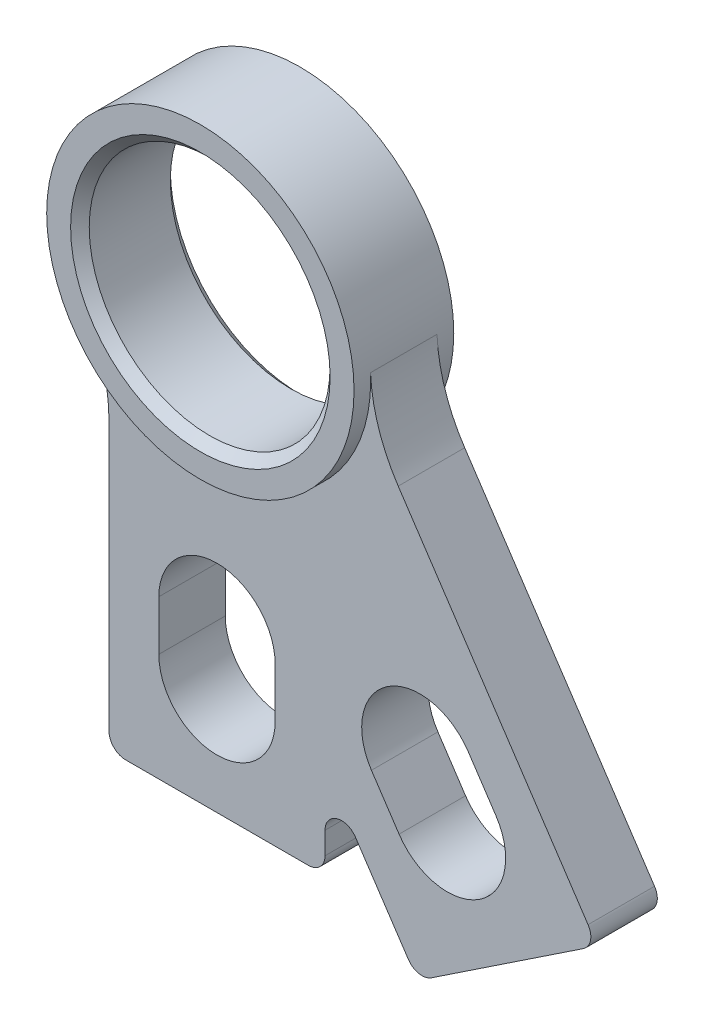
ISO-10303-21;
HEADER;
FILE_DESCRIPTION(('STEP AP214'),'2;1');
FILE_NAME('part.step','',(''),(''),'','','');
FILE_SCHEMA(('AUTOMOTIVE_DESIGN { 1 0 10303 214 1 1 1 1 }'));
ENDSEC;
DATA;
#1=APPLICATION_CONTEXT('core data for automotive mechanical design processes');
#2=APPLICATION_PROTOCOL_DEFINITION('international standard','automotive_design',2000,#1);
#3=PRODUCT_CONTEXT('',#1,'mechanical');
#4=PRODUCT('Part','Part','',(#3));
#5=PRODUCT_RELATED_PRODUCT_CATEGORY('part','',(#4));
#6=PRODUCT_DEFINITION_FORMATION('','',#4);
#7=PRODUCT_DEFINITION_CONTEXT('part definition',#1,'design');
#8=PRODUCT_DEFINITION('design','',#6,#7);
#9=PRODUCT_DEFINITION_SHAPE('','',#8);
#10=(LENGTH_UNIT() NAMED_UNIT(*) SI_UNIT(.MILLI.,.METRE.));
#11=(NAMED_UNIT(*) PLANE_ANGLE_UNIT() SI_UNIT($,.RADIAN.));
#12=(NAMED_UNIT(*) SI_UNIT($,.STERADIAN.) SOLID_ANGLE_UNIT());
#13=UNCERTAINTY_MEASURE_WITH_UNIT(LENGTH_MEASURE(1.E-05),#10,'distance_accuracy_value','');
#14=(GEOMETRIC_REPRESENTATION_CONTEXT(3) GLOBAL_UNCERTAINTY_ASSIGNED_CONTEXT((#13)) GLOBAL_UNIT_ASSIGNED_CONTEXT((#10,
#11,#12)) REPRESENTATION_CONTEXT('',''));
#15=CARTESIAN_POINT('',(0.,0.,0.));
#16=DIRECTION('',(0.,0.,1.));
#17=DIRECTION('',(1.,0.,0.));
#18=AXIS2_PLACEMENT_3D('',#15,#16,#17);
#19=CARTESIAN_POINT('',(0.,0.,4.7625));
#20=DIRECTION('',(0.,0.,-1.));
#21=DIRECTION('',(-1.,0.,0.));
#22=AXIS2_PLACEMENT_3D('',#19,#20,#21);
#23=CYLINDRICAL_SURFACE('',#22,11.5062);
#24=CARTESIAN_POINT('',(0.,0.,-3.87350000000002));
#25=DIRECTION('',(0.,0.,1.));
#26=DIRECTION('',(1.,0.,0.));
#27=AXIS2_PLACEMENT_3D('',#24,#25,#26);
#28=CIRCLE('',#27,11.5062);
#29=CARTESIAN_POINT('',(-11.5062,0.,-3.87350000000002));
#30=VERTEX_POINT('',#29);
#31=EDGE_CURVE('E50',#30,#30,#28,.F.);
#32=CARTESIAN_POINT('',(0.,0.,3.87349999999995));
#33=DIRECTION('',(0.,0.,1.));
#34=DIRECTION('',(1.,0.,0.));
#35=AXIS2_PLACEMENT_3D('',#32,#33,#34);
#36=CIRCLE('',#35,11.5062);
#37=CARTESIAN_POINT('',(-11.5062,0.,3.87349999999995));
#38=VERTEX_POINT('',#37);
#39=EDGE_CURVE('E490',#38,#38,#36,.T.);
#40=CARTESIAN_POINT('',(-11.5062,0.,-3.87350000000002));
#41=CARTESIAN_POINT('',(-11.5062,0.,-3.79280208333335));
#42=CARTESIAN_POINT('',(-11.5062,0.,-3.71210416666669));
#43=CARTESIAN_POINT('',(-11.5062,0.,-3.55070833333335));
#44=CARTESIAN_POINT('',(-11.5062,0.,-3.47001041666669));
#45=CARTESIAN_POINT('',(-11.5062,0.,-3.30861458333336));
#46=CARTESIAN_POINT('',(-11.5062,0.,-3.22791666666669));
#47=CARTESIAN_POINT('',(-11.5062,0.,-3.06652083333336));
#48=CARTESIAN_POINT('',(-11.5062,0.,-2.98582291666669));
#49=CARTESIAN_POINT('',(-11.5062,0.,-2.82442708333336));
#50=CARTESIAN_POINT('',(-11.5062,0.,-2.74372916666669));
#51=CARTESIAN_POINT('',(-11.5062,0.,-2.58233333333336));
#52=CARTESIAN_POINT('',(-11.5062,0.,-2.50163541666669));
#53=CARTESIAN_POINT('',(-11.5062,0.,-2.34023958333336));
#54=CARTESIAN_POINT('',(-11.5062,0.,-2.25954166666669));
#55=CARTESIAN_POINT('',(-11.5062,0.,-2.09814583333336));
#56=CARTESIAN_POINT('',(-11.5062,0.,-2.01744791666669));
#57=CARTESIAN_POINT('',(-11.5062,0.,-1.85605208333336));
#58=CARTESIAN_POINT('',(-11.5062,0.,-1.7753541666667));
#59=CARTESIAN_POINT('',(-11.5062,0.,-1.61395833333336));
#60=CARTESIAN_POINT('',(-11.5062,0.,-1.5332604166667));
#61=CARTESIAN_POINT('',(-11.5062,0.,-1.37186458333336));
#62=CARTESIAN_POINT('',(-11.5062,0.,-1.2911666666667));
#63=CARTESIAN_POINT('',(-11.5062,0.,-1.12977083333336));
#64=CARTESIAN_POINT('',(-11.5062,0.,-1.0490729166667));
#65=CARTESIAN_POINT('',(-11.5062,0.,-0.887677083333366));
#66=CARTESIAN_POINT('',(-11.5062,0.,-0.8069791666667));
#67=CARTESIAN_POINT('',(-11.5062,0.,-0.645583333333367));
#68=CARTESIAN_POINT('',(-11.5062,0.,-0.5648854166667));
#69=CARTESIAN_POINT('',(-11.5062,0.,-0.403489583333367));
#70=CARTESIAN_POINT('',(-11.5062,0.,-0.322791666666701));
#71=CARTESIAN_POINT('',(-11.5062,0.,-0.161395833333368));
#72=CARTESIAN_POINT('',(-11.5062,0.,-0.080697916666702));
#73=CARTESIAN_POINT('',(-11.5062,0.,0.0806979166666309));
#74=CARTESIAN_POINT('',(-11.5062,0.,0.161395833333297));
#75=CARTESIAN_POINT('',(-11.5062,0.,0.32279166666663));
#76=CARTESIAN_POINT('',(-11.5062,0.,0.403489583333297));
#77=CARTESIAN_POINT('',(-11.5062,0.,0.564885416666629));
#78=CARTESIAN_POINT('',(-11.5062,0.,0.645583333333295));
#79=CARTESIAN_POINT('',(-11.5062,0.,0.806979166666628));
#80=CARTESIAN_POINT('',(-11.5062,0.,0.887677083333294));
#81=CARTESIAN_POINT('',(-11.5062,0.,1.04907291666663));
#82=CARTESIAN_POINT('',(-11.5062,0.,1.12977083333329));
#83=CARTESIAN_POINT('',(-11.5062,0.,1.29116666666663));
#84=CARTESIAN_POINT('',(-11.5062,0.,1.37186458333329));
#85=CARTESIAN_POINT('',(-11.5062,0.,1.53326041666663));
#86=CARTESIAN_POINT('',(-11.5062,0.,1.61395833333329));
#87=CARTESIAN_POINT('',(-11.5062,0.,1.77535416666662));
#88=CARTESIAN_POINT('',(-11.5062,0.,1.85605208333329));
#89=CARTESIAN_POINT('',(-11.5062,0.,2.01744791666662));
#90=CARTESIAN_POINT('',(-11.5062,0.,2.09814583333329));
#91=CARTESIAN_POINT('',(-11.5062,0.,2.25954166666662));
#92=CARTESIAN_POINT('',(-11.5062,0.,2.34023958333329));
#93=CARTESIAN_POINT('',(-11.5062,0.,2.50163541666662));
#94=CARTESIAN_POINT('',(-11.5062,0.,2.58233333333329));
#95=CARTESIAN_POINT('',(-11.5062,0.,2.74372916666662));
#96=CARTESIAN_POINT('',(-11.5062,0.,2.82442708333329));
#97=CARTESIAN_POINT('',(-11.5062,0.,2.98582291666662));
#98=CARTESIAN_POINT('',(-11.5062,0.,3.06652083333329));
#99=CARTESIAN_POINT('',(-11.5062,0.,3.22791666666662));
#100=CARTESIAN_POINT('',(-11.5062,0.,3.30861458333328));
#101=CARTESIAN_POINT('',(-11.5062,0.,3.47001041666662));
#102=CARTESIAN_POINT('',(-11.5062,0.,3.55070833333328));
#103=CARTESIAN_POINT('',(-11.5062,0.,3.71210416666662));
#104=CARTESIAN_POINT('',(-11.5062,0.,3.79280208333328));
#105=CARTESIAN_POINT('',(-11.5062,0.,3.87349999999995));
#106=B_SPLINE_CURVE_WITH_KNOTS('',3,(#40,#41,#42,#43,#44,#45,#46,#47,#48,#49,#50,#51,#52,#53,
#54,#55,#56,#57,#58,#59,#60,#61,#62,#63,#64,#65,#66,#67,#68,#69,#70,#71,#72,#73,#74,#75,#76,#77,
#78,#79,#80,#81,#82,#83,#84,#85,#86,#87,#88,#89,#90,#91,#92,#93,#94,#95,#96,#97,#98,#99,#100,
#101,#102,#103,#104,#105),.UNSPECIFIED.,.F.,.F.,(4,2,2,2,2,2,2,2,2,2,2,2,2,2,2,2,2,2,2,2,2,2,2,
2,2,2,2,2,2,2,2,2,4),(0.,0.242093749999998,0.484187499999998,0.726281249999997,
0.968374999999995,1.21046874999999,1.45256249999999,1.69465624999999,1.93674999999999,
2.17884374999999,2.42093749999999,2.66303124999999,2.90512499999999,3.14721874999999,
3.38931249999999,3.63140624999999,3.87349999999998,4.11559374999998,4.35768749999998,
4.59978124999998,4.84187499999998,5.08396874999998,5.32606249999998,5.56815624999998,
5.81024999999998,6.05234374999998,6.29443749999997,6.53653124999997,6.77862499999997,
7.02071874999997,7.26281249999997,7.50490624999997,7.74699999999997),.UNSPECIFIED.);
#107=EDGE_CURVE('BSEAM41',#30,#38,#106,.T.);
#108=ORIENTED_EDGE('',*,*,#31,.T.);
#109=ORIENTED_EDGE('',*,*,#39,.T.);
#110=ORIENTED_EDGE('',*,*,#107,.T.);
#111=ORIENTED_EDGE('',*,*,#107,.F.);
#112=EDGE_LOOP('',(#108,#110,#109,#111));
#113=FACE_BOUND('',#112,.T.);
#114=ADVANCED_FACE('F41',(#113),#23,.F.);
#115=CARTESIAN_POINT('',(0.,0.,4.7625));
#116=DIRECTION('',(0.,0.,-1.));
#117=DIRECTION('',(-1.,0.,0.));
#118=AXIS2_PLACEMENT_3D('',#115,#116,#117);
#119=CYLINDRICAL_SURFACE('',#118,14.6812);
#120=DIRECTION('',(0.,0.,-1.));
#121=VECTOR('',#120,1.);
#122=CARTESIAN_POINT('',(-12.585193266832,-7.55979787272684,3.175));
#123=LINE('',#122,#121);
#124=CARTESIAN_POINT('',(-12.585193266832,-7.55979787272684,3.175));
#125=VERTEX_POINT('',#124);
#126=CARTESIAN_POINT('',(-12.585193266832,-7.55979787272684,-3.175));
#127=VERTEX_POINT('',#126);
#128=EDGE_CURVE('E249',#125,#127,#123,.T.);
#129=ORIENTED_EDGE('',*,*,#128,.F.);
#130=CARTESIAN_POINT('',(0.,0.,3.175));
#131=DIRECTION('',(0.,0.,1.));
#132=DIRECTION('',(1.,0.,0.));
#133=AXIS2_PLACEMENT_3D('',#130,#131,#132);
#134=CIRCLE('',#133,14.6812);
#135=CARTESIAN_POINT('',(14.6650649234858,0.688116436328533,3.175));
#136=VERTEX_POINT('',#135);
#137=EDGE_CURVE('E266',#125,#136,#134,.T.);
#138=ORIENTED_EDGE('',*,*,#137,.T.);
#139=DIRECTION('',(0.,0.,-1.));
#140=VECTOR('',#139,1.);
#141=CARTESIAN_POINT('',(14.6650649234858,0.688116436328532,3.175));
#142=LINE('',#141,#140);
#143=CARTESIAN_POINT('',(14.6650649234858,0.688116436328532,-3.175));
#144=VERTEX_POINT('',#143);
#145=EDGE_CURVE('E323',#136,#144,#142,.T.);
#146=ORIENTED_EDGE('',*,*,#145,.T.);
#147=CARTESIAN_POINT('',(0.,0.,-3.175));
#148=DIRECTION('',(0.,0.,1.));
#149=DIRECTION('',(1.,0.,0.));
#150=AXIS2_PLACEMENT_3D('',#147,#148,#149);
#151=CIRCLE('',#150,14.6812);
#152=EDGE_CURVE('E324',#127,#144,#151,.T.);
#153=ORIENTED_EDGE('',*,*,#152,.F.);
#154=EDGE_LOOP('',(#129,#138,#146,#153));
#155=FACE_BOUND('',#154,.T.);
#156=CARTESIAN_POINT('',(0.,0.,4.7625));
#157=DIRECTION('',(0.,0.,1.));
#158=DIRECTION('',(1.,0.,0.));
#159=AXIS2_PLACEMENT_3D('',#156,#157,#158);
#160=CIRCLE('',#159,14.6812);
#161=CARTESIAN_POINT('',(14.6812,0.,4.7625));
#162=VERTEX_POINT('',#161);
#163=EDGE_CURVE('E418',#162,#162,#160,.T.);
#164=ORIENTED_EDGE('',*,*,#163,.F.);
#165=EDGE_LOOP('',(#164));
#166=FACE_BOUND('',#165,.T.);
#167=CARTESIAN_POINT('',(0.,0.,-4.7625));
#168=DIRECTION('',(0.,0.,1.));
#169=DIRECTION('',(1.,0.,0.));
#170=AXIS2_PLACEMENT_3D('',#167,#168,#169);
#171=CIRCLE('',#170,14.6812);
#172=CARTESIAN_POINT('',(14.6812,0.,-4.7625));
#173=VERTEX_POINT('',#172);
#174=EDGE_CURVE('E399',#173,#173,#171,.T.);
#175=ORIENTED_EDGE('',*,*,#174,.T.);
#176=EDGE_LOOP('',(#175));
#177=FACE_BOUND('',#176,.T.);
#178=ADVANCED_FACE('F513',(#155,#166,#177),#119,.T.);
#179=CARTESIAN_POINT('',(0.,0.,4.7625));
#180=DIRECTION('',(0.,0.,1.));
#181=DIRECTION('',(1.,0.,0.));
#182=AXIS2_PLACEMENT_3D('',#179,#180,#181);
#183=PLANE('',#182);
#184=CARTESIAN_POINT('',(0.,0.,4.7625));
#185=DIRECTION('',(0.,0.,1.));
#186=DIRECTION('',(1.,0.,0.));
#187=AXIS2_PLACEMENT_3D('',#184,#185,#186);
#188=CIRCLE('',#187,12.3952000000001);
#189=CARTESIAN_POINT('',(12.3952000000001,0.,4.7625));
#190=VERTEX_POINT('',#189);
#191=EDGE_CURVE('E11',#190,#190,#188,.F.);
#192=ORIENTED_EDGE('',*,*,#191,.T.);
#193=EDGE_LOOP('',(#192));
#194=FACE_BOUND('',#193,.T.);
#195=ORIENTED_EDGE('',*,*,#163,.T.);
#196=EDGE_LOOP('',(#195));
#197=FACE_BOUND('',#196,.T.);
#198=ADVANCED_FACE('F509',(#194,#197),#183,.T.);
#199=CARTESIAN_POINT('',(0.,0.,-4.7625));
#200=DIRECTION('',(0.,0.,1.));
#201=DIRECTION('',(1.,0.,0.));
#202=AXIS2_PLACEMENT_3D('',#199,#200,#201);
#203=PLANE('',#202);
#204=CARTESIAN_POINT('',(0.,0.,-4.7625));
#205=DIRECTION('',(0.,0.,1.));
#206=DIRECTION('',(1.,0.,0.));
#207=AXIS2_PLACEMENT_3D('',#204,#205,#206);
#208=CIRCLE('',#207,12.3952);
#209=CARTESIAN_POINT('',(-12.3952,0.,-4.7625));
#210=VERTEX_POINT('',#209);
#211=EDGE_CURVE('E486',#210,#210,#208,.T.);
#212=ORIENTED_EDGE('',*,*,#211,.T.);
#213=EDGE_LOOP('',(#212));
#214=FACE_BOUND('',#213,.T.);
#215=ORIENTED_EDGE('',*,*,#174,.F.);
#216=EDGE_LOOP('',(#215));
#217=FACE_BOUND('',#216,.T.);
#218=ADVANCED_FACE('F505',(#214,#217),#203,.F.);
#219=CARTESIAN_POINT('',(0.,-27.9580697939255,3.175));
#220=DIRECTION('',(0.,0.,-1.));
#221=DIRECTION('',(-1.,0.,0.));
#222=AXIS2_PLACEMENT_3D('',#219,#220,#221);
#223=CYLINDRICAL_SURFACE('',#222,5.55624999999843);
#224=CARTESIAN_POINT('',(0.,-27.9580697939255,-3.175));
#225=DIRECTION('',(0.,0.,1.));
#226=DIRECTION('',(1.,0.,0.));
#227=AXIS2_PLACEMENT_3D('',#224,#225,#226);
#228=CIRCLE('',#227,5.55624999999843);
#229=CARTESIAN_POINT('',(5.55624999999843,-27.9580697939256,-3.175));
#230=VERTEX_POINT('',#229);
#231=CARTESIAN_POINT('',(-5.55624999999843,-27.9580697939256,-3.175));
#232=VERTEX_POINT('',#231);
#233=EDGE_CURVE('E371',#230,#232,#228,.T.);
#234=ORIENTED_EDGE('',*,*,#233,.F.);
#235=DIRECTION('',(0.,0.,-1.));
#236=VECTOR('',#235,1.);
#237=CARTESIAN_POINT('',(5.55624999999843,-27.9580697939256,3.175));
#238=LINE('',#237,#236);
#239=CARTESIAN_POINT('',(5.55624999999843,-27.9580697939256,3.175));
#240=VERTEX_POINT('',#239);
#241=EDGE_CURVE('E396',#240,#230,#238,.T.);
#242=ORIENTED_EDGE('',*,*,#241,.F.);
#243=CARTESIAN_POINT('',(0.,-27.9580697939255,3.175));
#244=DIRECTION('',(0.,0.,1.));
#245=DIRECTION('',(1.,0.,0.));
#246=AXIS2_PLACEMENT_3D('',#243,#244,#245);
#247=CIRCLE('',#246,5.55624999999843);
#248=CARTESIAN_POINT('',(-5.55624999999843,-27.9580697939256,3.175));
#249=VERTEX_POINT('',#248);
#250=EDGE_CURVE('E308',#240,#249,#247,.T.);
#251=ORIENTED_EDGE('',*,*,#250,.T.);
#252=DIRECTION('',(0.,0.,-1.));
#253=VECTOR('',#252,1.);
#254=CARTESIAN_POINT('',(-5.55624999999843,-27.9580697939256,3.175));
#255=LINE('',#254,#253);
#256=EDGE_CURVE('E386',#249,#232,#255,.T.);
#257=ORIENTED_EDGE('',*,*,#256,.T.);
#258=EDGE_LOOP('',(#234,#242,#251,#257));
#259=FACE_BOUND('',#258,.T.);
#260=ADVANCED_FACE('F508',(#259),#223,.F.);
#261=CARTESIAN_POINT('',(5.55624999999843,0.,3.175));
#262=DIRECTION('',(-1.,0.,0.));
#263=DIRECTION('',(0.,0.,1.));
#264=AXIS2_PLACEMENT_3D('',#261,#262,#263);
#265=PLANE('',#264);
#266=DIRECTION('',(0.,1.,0.));
#267=VECTOR('',#266,1.);
#268=CARTESIAN_POINT('',(5.55624999999843,0.,-3.175));
#269=LINE('',#268,#267);
#270=CARTESIAN_POINT('',(5.55624999999843,-32.7205697939288,-3.175));
#271=VERTEX_POINT('',#270);
#272=EDGE_CURVE('E375',#271,#230,#269,.T.);
#273=ORIENTED_EDGE('',*,*,#272,.F.);
#274=DIRECTION('',(0.,0.,-1.));
#275=VECTOR('',#274,1.);
#276=CARTESIAN_POINT('',(5.55624999999843,-32.7205697939288,3.175));
#277=LINE('',#276,#275);
#278=CARTESIAN_POINT('',(5.55624999999843,-32.7205697939288,3.175));
#279=VERTEX_POINT('',#278);
#280=EDGE_CURVE('E393',#279,#271,#277,.T.);
#281=ORIENTED_EDGE('',*,*,#280,.F.);
#282=DIRECTION('',(0.,1.,0.));
#283=VECTOR('',#282,1.);
#284=CARTESIAN_POINT('',(5.55624999999843,0.,3.175));
#285=LINE('',#284,#283);
#286=EDGE_CURVE('E312',#279,#240,#285,.T.);
#287=ORIENTED_EDGE('',*,*,#286,.T.);
#288=ORIENTED_EDGE('',*,*,#241,.T.);
#289=EDGE_LOOP('',(#273,#281,#287,#288));
#290=FACE_BOUND('',#289,.T.);
#291=ADVANCED_FACE('F652',(#290),#265,.T.);
#292=CARTESIAN_POINT('',(0.,-32.7205697939288,3.175));
#293=DIRECTION('',(0.,0.,-1.));
#294=DIRECTION('',(-1.,0.,0.));
#295=AXIS2_PLACEMENT_3D('',#292,#293,#294);
#296=CYLINDRICAL_SURFACE('',#295,5.55624999999843);
#297=CARTESIAN_POINT('',(0.,-32.7205697939288,-3.175));
#298=DIRECTION('',(0.,0.,1.));
#299=DIRECTION('',(1.,0.,0.));
#300=AXIS2_PLACEMENT_3D('',#297,#298,#299);
#301=CIRCLE('',#300,5.55624999999843);
#302=CARTESIAN_POINT('',(-5.55624999999843,-32.7205697939288,-3.175));
#303=VERTEX_POINT('',#302);
#304=EDGE_CURVE('E379',#303,#271,#301,.T.);
#305=ORIENTED_EDGE('',*,*,#304,.F.);
#306=DIRECTION('',(0.,0.,-1.));
#307=VECTOR('',#306,1.);
#308=CARTESIAN_POINT('',(-5.55624999999843,-32.7205697939288,3.175));
#309=LINE('',#308,#307);
#310=CARTESIAN_POINT('',(-5.55624999999843,-32.7205697939288,3.175));
#311=VERTEX_POINT('',#310);
#312=EDGE_CURVE('E389',#311,#303,#309,.T.);
#313=ORIENTED_EDGE('',*,*,#312,.F.);
#314=CARTESIAN_POINT('',(0.,-32.7205697939288,3.175));
#315=DIRECTION('',(0.,0.,1.));
#316=DIRECTION('',(1.,0.,0.));
#317=AXIS2_PLACEMENT_3D('',#314,#315,#316);
#318=CIRCLE('',#317,5.55624999999843);
#319=EDGE_CURVE('E316',#311,#279,#318,.T.);
#320=ORIENTED_EDGE('',*,*,#319,.T.);
#321=ORIENTED_EDGE('',*,*,#280,.T.);
#322=EDGE_LOOP('',(#305,#313,#320,#321));
#323=FACE_BOUND('',#322,.T.);
#324=ADVANCED_FACE('F619',(#323),#296,.F.);
#325=CARTESIAN_POINT('',(19.3774540600737,-29.0780398371844,3.175));
#326=DIRECTION('',(0.,0.,-1.));
#327=DIRECTION('',(-1.,0.,0.));
#328=AXIS2_PLACEMENT_3D('',#325,#326,#327);
#329=CYLINDRICAL_SURFACE('',#328,5.55624999999838);
#330=CARTESIAN_POINT('',(19.3774540600737,-29.0780398371844,-3.175));
#331=DIRECTION('',(0.,0.,1.));
#332=DIRECTION('',(1.,0.,0.));
#333=AXIS2_PLACEMENT_3D('',#330,#331,#332);
#334=CIRCLE('',#333,5.55624999999838);
#335=CARTESIAN_POINT('',(24.0011136239908,-25.9968572234013,-3.175));
#336=VERTEX_POINT('',#335);
#337=CARTESIAN_POINT('',(14.7537944961565,-32.1592224509675,-3.175));
#338=VERTEX_POINT('',#337);
#339=EDGE_CURVE('E355',#336,#338,#334,.T.);
#340=ORIENTED_EDGE('',*,*,#339,.F.);
#341=DIRECTION('',(0.,0.,-1.));
#342=VECTOR('',#341,1.);
#343=CARTESIAN_POINT('',(24.0011136239908,-25.9968572234013,3.175));
#344=LINE('',#343,#342);
#345=CARTESIAN_POINT('',(24.0011136239908,-25.9968572234013,3.175));
#346=VERTEX_POINT('',#345);
#347=EDGE_CURVE('E390',#346,#336,#344,.T.);
#348=ORIENTED_EDGE('',*,*,#347,.F.);
#349=CARTESIAN_POINT('',(19.3774540600737,-29.0780398371844,3.175));
#350=DIRECTION('',(0.,0.,1.));
#351=DIRECTION('',(1.,0.,0.));
#352=AXIS2_PLACEMENT_3D('',#349,#350,#351);
#353=CIRCLE('',#352,5.55624999999838);
#354=CARTESIAN_POINT('',(14.7537944961565,-32.1592224509675,3.175));
#355=VERTEX_POINT('',#354);
#356=EDGE_CURVE('E293',#346,#355,#353,.T.);
#357=ORIENTED_EDGE('',*,*,#356,.T.);
#358=DIRECTION('',(0.,0.,-1.));
#359=VECTOR('',#358,1.);
#360=CARTESIAN_POINT('',(14.7537944961565,-32.1592224509675,3.175));
#361=LINE('',#360,#359);
#362=EDGE_CURVE('E400',#355,#338,#361,.T.);
#363=ORIENTED_EDGE('',*,*,#362,.T.);
#364=EDGE_LOOP('',(#340,#348,#357,#363));
#365=FACE_BOUND('',#364,.T.);
#366=ADVANCED_FACE('F611',(#365),#329,.F.);
#367=CARTESIAN_POINT('',(4.62365956391723,3.08118261378313,3.175));
#368=DIRECTION('',(-0.832154702167563,-0.554543552537052,0.));
#369=DIRECTION('',(0.554543552537052,-0.832154702167563,0.));
#370=AXIS2_PLACEMENT_3D('',#367,#368,#369);
#371=PLANE('',#370);
#372=DIRECTION('',(-0.554543552537052,0.832154702167563,0.));
#373=VECTOR('',#372,1.);
#374=CARTESIAN_POINT('',(4.62365956391723,3.08118261378313,-3.175));
#375=LINE('',#374,#373);
#376=CARTESIAN_POINT('',(26.6421272929503,-29.959993992477,-3.175));
#377=VERTEX_POINT('',#376);
#378=EDGE_CURVE('E359',#377,#336,#375,.T.);
#379=ORIENTED_EDGE('',*,*,#378,.F.);
#380=DIRECTION('',(0.,0.,-1.));
#381=VECTOR('',#380,1.);
#382=CARTESIAN_POINT('',(26.6421272929503,-29.959993992477,3.175));
#383=LINE('',#382,#381);
#384=CARTESIAN_POINT('',(26.6421272929503,-29.959993992477,3.175));
#385=VERTEX_POINT('',#384);
#386=EDGE_CURVE('E406',#385,#377,#383,.T.);
#387=ORIENTED_EDGE('',*,*,#386,.F.);
#388=DIRECTION('',(-0.554543552537052,0.832154702167563,0.));
#389=VECTOR('',#388,1.);
#390=CARTESIAN_POINT('',(4.62365956391723,3.08118261378313,3.175));
#391=LINE('',#390,#389);
#392=EDGE_CURVE('E297',#385,#346,#391,.T.);
#393=ORIENTED_EDGE('',*,*,#392,.T.);
#394=ORIENTED_EDGE('',*,*,#347,.T.);
#395=EDGE_LOOP('',(#379,#387,#393,#394));
#396=FACE_BOUND('',#395,.T.);
#397=ADVANCED_FACE('F605',(#396),#371,.T.);
#398=CARTESIAN_POINT('',(22.0184677290332,-33.0411766062601,3.175));
#399=DIRECTION('',(0.,0.,-1.));
#400=DIRECTION('',(-1.,0.,0.));
#401=AXIS2_PLACEMENT_3D('',#398,#399,#400);
#402=CYLINDRICAL_SURFACE('',#401,5.55624999999838);
#403=CARTESIAN_POINT('',(22.0184677290332,-33.0411766062601,-3.175));
#404=DIRECTION('',(0.,0.,1.));
#405=DIRECTION('',(1.,0.,0.));
#406=AXIS2_PLACEMENT_3D('',#403,#404,#405);
#407=CIRCLE('',#406,5.55624999999838);
#408=CARTESIAN_POINT('',(17.394808165116,-36.1223592200432,-3.175));
#409=VERTEX_POINT('',#408);
#410=EDGE_CURVE('E363',#409,#377,#407,.T.);
#411=ORIENTED_EDGE('',*,*,#410,.F.);
#412=DIRECTION('',(0.,0.,-1.));
#413=VECTOR('',#412,1.);
#414=CARTESIAN_POINT('',(17.394808165116,-36.1223592200432,3.175));
#415=LINE('',#414,#413);
#416=CARTESIAN_POINT('',(17.394808165116,-36.1223592200432,3.175));
#417=VERTEX_POINT('',#416);
#418=EDGE_CURVE('E403',#417,#409,#415,.T.);
#419=ORIENTED_EDGE('',*,*,#418,.F.);
#420=CARTESIAN_POINT('',(22.0184677290332,-33.0411766062601,3.175));
#421=DIRECTION('',(0.,0.,1.));
#422=DIRECTION('',(1.,0.,0.));
#423=AXIS2_PLACEMENT_3D('',#420,#421,#422);
#424=CIRCLE('',#423,5.55624999999838);
#425=EDGE_CURVE('E301',#417,#385,#424,.T.);
#426=ORIENTED_EDGE('',*,*,#425,.T.);
#427=ORIENTED_EDGE('',*,*,#386,.T.);
#428=EDGE_LOOP('',(#411,#419,#426,#427));
#429=FACE_BOUND('',#428,.T.);
#430=ADVANCED_FACE('F601',(#429),#402,.F.);
#431=CARTESIAN_POINT('',(-26.1937499999968,-15.7343197939272,3.175));
#432=DIRECTION('',(0.,0.,-1.));
#433=DIRECTION('',(-1.,0.,0.));
#434=AXIS2_PLACEMENT_3D('',#431,#432,#433);
#435=CYLINDRICAL_SURFACE('',#434,15.8749999999984);
#436=CARTESIAN_POINT('',(-26.1937499999968,-15.7343197939272,-3.175));
#437=DIRECTION('',(0.,0.,1.));
#438=DIRECTION('',(1.,0.,0.));
#439=AXIS2_PLACEMENT_3D('',#436,#437,#438);
#440=CIRCLE('',#439,15.8749999999984);
#441=CARTESIAN_POINT('',(-10.3187499999984,-15.7343197939272,-3.175));
#442=VERTEX_POINT('',#441);
#443=EDGE_CURVE('E244',#442,#127,#440,.T.);
#444=ORIENTED_EDGE('',*,*,#443,.F.);
#445=DIRECTION('',(0.,0.,-1.));
#446=VECTOR('',#445,1.);
#447=CARTESIAN_POINT('',(-10.3187499999984,-15.7343197939272,3.175));
#448=LINE('',#447,#446);
#449=CARTESIAN_POINT('',(-10.3187499999984,-15.7343197939272,3.175));
#450=VERTEX_POINT('',#449);
#451=EDGE_CURVE('E237',#450,#442,#448,.T.);
#452=ORIENTED_EDGE('',*,*,#451,.F.);
#453=CARTESIAN_POINT('',(-26.1937499999968,-15.7343197939272,3.175));
#454=DIRECTION('',(0.,0.,1.));
#455=DIRECTION('',(1.,0.,0.));
#456=AXIS2_PLACEMENT_3D('',#453,#454,#455);
#457=CIRCLE('',#456,15.8749999999984);
#458=EDGE_CURVE('E242',#450,#125,#457,.T.);
#459=ORIENTED_EDGE('',*,*,#458,.T.);
#460=ORIENTED_EDGE('',*,*,#128,.T.);
#461=EDGE_LOOP('',(#444,#452,#459,#460));
#462=FACE_BOUND('',#461,.T.);
#463=ADVANCED_FACE('F239',(#462),#435,.F.);
#464=CARTESIAN_POINT('',(-10.3187499999984,0.,3.175));
#465=DIRECTION('',(1.,0.,0.));
#466=DIRECTION('',(0.,1.,0.));
#467=AXIS2_PLACEMENT_3D('',#464,#465,#466);
#468=PLANE('',#467);
#469=DIRECTION('',(0.,-1.,0.));
#470=VECTOR('',#469,1.);
#471=CARTESIAN_POINT('',(-10.3187499999984,0.,-3.175));
#472=LINE('',#471,#470);
#473=CARTESIAN_POINT('',(-10.3187499999984,-41.4518197939272,-3.175));
#474=VERTEX_POINT('',#473);
#475=EDGE_CURVE('E330',#442,#474,#472,.T.);
#476=ORIENTED_EDGE('',*,*,#475,.T.);
#477=DIRECTION('',(0.,0.,-1.));
#478=VECTOR('',#477,1.);
#479=CARTESIAN_POINT('',(-10.3187499999984,-41.4518197939272,3.175));
#480=LINE('',#479,#478);
#481=CARTESIAN_POINT('',(-10.3187499999984,-41.4518197939272,3.175));
#482=VERTEX_POINT('',#481);
#483=EDGE_CURVE('E256',#474,#482,#480,.F.);
#484=ORIENTED_EDGE('',*,*,#483,.T.);
#485=DIRECTION('',(0.,-1.,0.));
#486=VECTOR('',#485,1.);
#487=CARTESIAN_POINT('',(-10.3187499999984,0.,3.175));
#488=LINE('',#487,#486);
#489=EDGE_CURVE('E253',#450,#482,#488,.T.);
#490=ORIENTED_EDGE('',*,*,#489,.F.);
#491=ORIENTED_EDGE('',*,*,#451,.T.);
#492=EDGE_LOOP('',(#476,#484,#490,#491));
#493=FACE_BOUND('',#492,.T.);
#494=ADVANCED_FACE('F254',(#493),#468,.F.);
#495=CARTESIAN_POINT('',(0.,-43.0393197939271,3.175));
#496=DIRECTION('',(0.,1.,0.));
#497=DIRECTION('',(-1.,0.,0.));
#498=AXIS2_PLACEMENT_3D('',#495,#496,#497);
#499=PLANE('',#498);
#500=DIRECTION('',(1.,0.,0.));
#501=VECTOR('',#500,1.);
#502=CARTESIAN_POINT('',(0.,-43.0393197939271,-3.175));
#503=LINE('',#502,#501);
#504=CARTESIAN_POINT('',(-8.73124999999843,-43.0393197939271,-3.175));
#505=VERTEX_POINT('',#504);
#506=CARTESIAN_POINT('',(8.73124999999837,-43.0393197939271,-3.175));
#507=VERTEX_POINT('',#506);
#508=EDGE_CURVE('E333',#505,#507,#503,.T.);
#509=ORIENTED_EDGE('',*,*,#508,.T.);
#510=DIRECTION('',(0.,0.,-1.));
#511=VECTOR('',#510,1.);
#512=CARTESIAN_POINT('',(8.73124999999837,-43.0393197939271,3.175));
#513=LINE('',#512,#511);
#514=CARTESIAN_POINT('',(8.73124999999837,-43.0393197939271,3.175));
#515=VERTEX_POINT('',#514);
#516=EDGE_CURVE('E447',#507,#515,#513,.F.);
#517=ORIENTED_EDGE('',*,*,#516,.T.);
#518=DIRECTION('',(1.,0.,0.));
#519=VECTOR('',#518,1.);
#520=CARTESIAN_POINT('',(0.,-43.0393197939271,3.175));
#521=LINE('',#520,#519);
#522=CARTESIAN_POINT('',(-8.73124999999843,-43.0393197939271,3.175));
#523=VERTEX_POINT('',#522);
#524=EDGE_CURVE('E259',#523,#515,#521,.T.);
#525=ORIENTED_EDGE('',*,*,#524,.F.);
#526=DIRECTION('',(0.,0.,-1.));
#527=VECTOR('',#526,1.);
#528=CARTESIAN_POINT('',(-8.73124999999843,-43.0393197939271,3.175));
#529=LINE('',#528,#527);
#530=EDGE_CURVE('E443',#523,#505,#529,.T.);
#531=ORIENTED_EDGE('',*,*,#530,.T.);
#532=EDGE_LOOP('',(#509,#517,#525,#531));
#533=FACE_BOUND('',#532,.T.);
#534=ADVANCED_FACE('F565',(#533),#499,.F.);
#535=CARTESIAN_POINT('',(10.3187499999986,0.,3.175));
#536=DIRECTION('',(1.,0.,0.));
#537=DIRECTION('',(0.,1.,0.));
#538=AXIS2_PLACEMENT_3D('',#535,#536,#537);
#539=PLANE('',#538);
#540=DIRECTION('',(0.,-1.,0.));
#541=VECTOR('',#540,1.);
#542=CARTESIAN_POINT('',(10.3187499999986,0.,3.175));
#543=LINE('',#542,#541);
#544=CARTESIAN_POINT('',(10.3187499999984,-39.3370219938171,3.175));
#545=VERTEX_POINT('',#544);
#546=CARTESIAN_POINT('',(10.3187499999984,-41.4518197939271,3.175));
#547=VERTEX_POINT('',#546);
#548=EDGE_CURVE('E276',#545,#547,#543,.T.);
#549=ORIENTED_EDGE('',*,*,#548,.T.);
#550=DIRECTION('',(0.,0.,-1.));
#551=VECTOR('',#550,1.);
#552=CARTESIAN_POINT('',(10.3187499999984,-41.4518197939271,-3.175));
#553=LINE('',#552,#551);
#554=CARTESIAN_POINT('',(10.3187499999984,-41.4518197939271,-3.175));
#555=VERTEX_POINT('',#554);
#556=EDGE_CURVE('E427',#547,#555,#553,.T.);
#557=ORIENTED_EDGE('',*,*,#556,.T.);
#558=DIRECTION('',(0.,-1.,0.));
#559=VECTOR('',#558,1.);
#560=CARTESIAN_POINT('',(10.3187499999986,0.,-3.175));
#561=LINE('',#560,#559);
#562=CARTESIAN_POINT('',(10.3187499999984,-39.3370219938171,-3.175));
#563=VERTEX_POINT('',#562);
#564=EDGE_CURVE('E337',#563,#555,#561,.T.);
#565=ORIENTED_EDGE('',*,*,#564,.F.);
#566=DIRECTION('',(0.,0.,-1.));
#567=VECTOR('',#566,1.);
#568=CARTESIAN_POINT('',(10.3187499999984,-39.3370219938171,3.175));
#569=LINE('',#568,#567);
#570=EDGE_CURVE('E422',#563,#545,#569,.F.);
#571=ORIENTED_EDGE('',*,*,#570,.T.);
#572=EDGE_LOOP('',(#549,#557,#565,#571));
#573=FACE_BOUND('',#572,.T.);
#574=ADVANCED_FACE('F571',(#573),#539,.T.);
#575=CARTESIAN_POINT('',(-8.58679633299011,-5.72219628274075,3.175));
#576=DIRECTION('',(-0.832154702167563,-0.554543552537052,0.));
#577=DIRECTION('',(0.554543552537052,-0.832154702167563,0.));
#578=AXIS2_PLACEMENT_3D('',#575,#576,#577);
#579=PLANE('',#578);
#580=DIRECTION('',(-0.554543552537052,0.832154702167563,0.));
#581=VECTOR('',#580,1.);
#582=CARTESIAN_POINT('',(-8.58679633299011,-5.72219628274075,-3.175));
#583=LINE('',#582,#581);
#584=CARTESIAN_POINT('',(18.2735297891312,-46.0291236323001,-3.175));
#585=VERTEX_POINT('',#584);
#586=CARTESIAN_POINT('',(13.2272955896894,-38.4566841041645,-3.175));
#587=VERTEX_POINT('',#586);
#588=EDGE_CURVE('E341',#585,#587,#583,.T.);
#589=ORIENTED_EDGE('',*,*,#588,.F.);
#590=DIRECTION('',(0.,0.,-1.));
#591=VECTOR('',#590,1.);
#592=CARTESIAN_POINT('',(18.2735297891312,-46.0291236323001,3.175));
#593=LINE('',#592,#591);
#594=CARTESIAN_POINT('',(18.2735297891312,-46.0291236323001,3.175));
#595=VERTEX_POINT('',#594);
#596=EDGE_CURVE('E471',#585,#595,#593,.F.);
#597=ORIENTED_EDGE('',*,*,#596,.T.);
#598=DIRECTION('',(-0.554543552537052,0.832154702167563,0.));
#599=VECTOR('',#598,1.);
#600=CARTESIAN_POINT('',(-8.58679633299011,-5.72219628274075,3.175));
#601=LINE('',#600,#599);
#602=CARTESIAN_POINT('',(13.2272955896894,-38.4566841041645,3.175));
#603=VERTEX_POINT('',#602);
#604=EDGE_CURVE('E280',#595,#603,#601,.T.);
#605=ORIENTED_EDGE('',*,*,#604,.T.);
#606=DIRECTION('',(0.,0.,-1.));
#607=VECTOR('',#606,1.);
#608=CARTESIAN_POINT('',(13.2272955896894,-38.4566841041645,-3.175));
#609=LINE('',#608,#607);
#610=EDGE_CURVE('E467',#603,#587,#609,.T.);
#611=ORIENTED_EDGE('',*,*,#610,.T.);
#612=EDGE_LOOP('',(#589,#597,#605,#611));
#613=FACE_BOUND('',#612,.T.);
#614=ADVANCED_FACE('F579',(#613),#579,.T.);
#615=CARTESIAN_POINT('',(27.740664011774,-41.6279729392503,3.175));
#616=DIRECTION('',(-0.554543552537054,0.832154702167562,0.));
#617=DIRECTION('',(-0.832154702167562,-0.554543552537054,0.));
#618=AXIS2_PLACEMENT_3D('',#615,#616,#617);
#619=PLANE('',#618);
#620=DIRECTION('',(0.832154702167562,0.554543552537054,0.));
#621=VECTOR('',#620,1.);
#622=CARTESIAN_POINT('',(27.740664011774,-41.6279729392503,3.175));
#623=LINE('',#622,#621);
#624=CARTESIAN_POINT('',(20.4749132684748,-46.4698313323385,3.175));
#625=VERTEX_POINT('',#624);
#626=CARTESIAN_POINT('',(35.0064147550732,-36.786114546162,3.175));
#627=VERTEX_POINT('',#626);
#628=EDGE_CURVE('E284',#625,#627,#623,.T.);
#629=ORIENTED_EDGE('',*,*,#628,.F.);
#630=DIRECTION('',(0.,0.,-1.));
#631=VECTOR('',#630,1.);
#632=CARTESIAN_POINT('',(20.4749132684748,-46.4698313323385,-3.175));
#633=LINE('',#632,#631);
#634=CARTESIAN_POINT('',(20.4749132684748,-46.4698313323385,-3.175));
#635=VERTEX_POINT('',#634);
#636=EDGE_CURVE('E463',#625,#635,#633,.T.);
#637=ORIENTED_EDGE('',*,*,#636,.T.);
#638=DIRECTION('',(0.832154702167562,0.554543552537054,0.));
#639=VECTOR('',#638,1.);
#640=CARTESIAN_POINT('',(27.740664011774,-41.6279729392503,-3.175));
#641=LINE('',#640,#639);
#642=CARTESIAN_POINT('',(35.0064147550732,-36.786114546162,-3.175));
#643=VERTEX_POINT('',#642);
#644=EDGE_CURVE('E345',#635,#643,#641,.T.);
#645=ORIENTED_EDGE('',*,*,#644,.T.);
#646=DIRECTION('',(0.,0.,-1.));
#647=VECTOR('',#646,1.);
#648=CARTESIAN_POINT('',(35.0064147550732,-36.786114546162,3.175));
#649=LINE('',#648,#647);
#650=EDGE_CURVE('E69',#643,#627,#649,.F.);
#651=ORIENTED_EDGE('',*,*,#650,.T.);
#652=EDGE_LOOP('',(#629,#637,#645,#651));
#653=FACE_BOUND('',#652,.T.);
#654=ADVANCED_FACE('F582',(#653),#619,.F.);
#655=CARTESIAN_POINT('',(8.58679633299029,5.72219628274089,3.175));
#656=DIRECTION('',(-0.832154702167563,-0.554543552537053,0.));
#657=DIRECTION('',(0.554543552537053,-0.832154702167563,0.));
#658=AXIS2_PLACEMENT_3D('',#655,#656,#657);
#659=PLANE('',#658);
#660=DIRECTION('',(-0.554543552537053,0.832154702167563,0.));
#661=VECTOR('',#660,1.);
#662=CARTESIAN_POINT('',(8.58679633299029,5.72219628274089,3.175));
#663=LINE('',#662,#661);
#664=CARTESIAN_POINT('',(35.4471224551117,-34.5847310668184,3.175));
#665=VERTEX_POINT('',#664);
#666=CARTESIAN_POINT('',(17.3121619282687,-7.37119191918367,3.175));
#667=VERTEX_POINT('',#666);
#668=EDGE_CURVE('E287',#665,#667,#663,.T.);
#669=ORIENTED_EDGE('',*,*,#668,.F.);
#670=DIRECTION('',(0.,0.,-1.));
#671=VECTOR('',#670,1.);
#672=CARTESIAN_POINT('',(35.4471224551117,-34.5847310668184,3.175));
#673=LINE('',#672,#671);
#674=CARTESIAN_POINT('',(35.4471224551117,-34.5847310668184,-3.175));
#675=VERTEX_POINT('',#674);
#676=EDGE_CURVE('E476',#665,#675,#673,.T.);
#677=ORIENTED_EDGE('',*,*,#676,.T.);
#678=DIRECTION('',(-0.554543552537053,0.832154702167563,0.));
#679=VECTOR('',#678,1.);
#680=CARTESIAN_POINT('',(8.58679633299029,5.72219628274089,-3.175));
#681=LINE('',#680,#679);
#682=CARTESIAN_POINT('',(17.3121619282687,-7.37119191918367,-3.175));
#683=VERTEX_POINT('',#682);
#684=EDGE_CURVE('E348',#675,#683,#681,.T.);
#685=ORIENTED_EDGE('',*,*,#684,.T.);
#686=DIRECTION('',(0.,0.,-1.));
#687=VECTOR('',#686,1.);
#688=CARTESIAN_POINT('',(17.3121619282687,-7.37119191918367,3.175));
#689=LINE('',#688,#687);
#690=EDGE_CURVE('E250',#667,#683,#689,.T.);
#691=ORIENTED_EDGE('',*,*,#690,.F.);
#692=EDGE_LOOP('',(#669,#677,#685,#691));
#693=FACE_BOUND('',#692,.T.);
#694=ADVANCED_FACE('F550',(#693),#659,.F.);
#695=CARTESIAN_POINT('',(-4.62365956391714,-3.08118261378308,3.175));
#696=DIRECTION('',(-0.832154702167563,-0.554543552537053,0.));
#697=DIRECTION('',(0.554543552537053,-0.832154702167563,0.));
#698=AXIS2_PLACEMENT_3D('',#695,#696,#697);
#699=PLANE('',#698);
#700=DIRECTION('',(-0.554543552537053,0.832154702167563,0.));
#701=VECTOR('',#700,1.);
#702=CARTESIAN_POINT('',(-4.62365956391714,-3.08118261378308,-3.175));
#703=LINE('',#702,#701);
#704=EDGE_CURVE('E367',#409,#338,#703,.T.);
#705=ORIENTED_EDGE('',*,*,#704,.T.);
#706=ORIENTED_EDGE('',*,*,#362,.F.);
#707=DIRECTION('',(-0.554543552537053,0.832154702167563,0.));
#708=VECTOR('',#707,1.);
#709=CARTESIAN_POINT('',(-4.62365956391714,-3.08118261378308,3.175));
#710=LINE('',#709,#708);
#711=EDGE_CURVE('E305',#417,#355,#710,.T.);
#712=ORIENTED_EDGE('',*,*,#711,.F.);
#713=ORIENTED_EDGE('',*,*,#418,.T.);
#714=EDGE_LOOP('',(#705,#706,#712,#713));
#715=FACE_BOUND('',#714,.T.);
#716=ADVANCED_FACE('F589',(#715),#699,.F.);
#717=CARTESIAN_POINT('',(30.5226178251774,1.43218697734114,3.175));
#718=DIRECTION('',(0.,0.,-1.));
#719=DIRECTION('',(-1.,0.,0.));
#720=AXIS2_PLACEMENT_3D('',#717,#718,#719);
#721=CYLINDRICAL_SURFACE('',#720,15.8749999999984);
#722=CARTESIAN_POINT('',(30.5226178251774,1.43218697734114,-3.175));
#723=DIRECTION('',(0.,0.,1.));
#724=DIRECTION('',(1.,0.,0.));
#725=AXIS2_PLACEMENT_3D('',#722,#723,#724);
#726=CIRCLE('',#725,15.8749999999984);
#727=EDGE_CURVE('E351',#683,#144,#726,.F.);
#728=ORIENTED_EDGE('',*,*,#727,.T.);
#729=ORIENTED_EDGE('',*,*,#145,.F.);
#730=CARTESIAN_POINT('',(30.5226178251774,1.43218697734114,3.175));
#731=DIRECTION('',(0.,0.,1.));
#732=DIRECTION('',(1.,0.,0.));
#733=AXIS2_PLACEMENT_3D('',#730,#731,#732);
#734=CIRCLE('',#733,15.8749999999984);
#735=EDGE_CURVE('E290',#667,#136,#734,.F.);
#736=ORIENTED_EDGE('',*,*,#735,.F.);
#737=ORIENTED_EDGE('',*,*,#690,.T.);
#738=EDGE_LOOP('',(#728,#729,#736,#737));
#739=FACE_BOUND('',#738,.T.);
#740=ADVANCED_FACE('F558',(#739),#721,.F.);
#741=CARTESIAN_POINT('',(-5.55624999999842,0.,3.175));
#742=DIRECTION('',(-1.,0.,0.));
#743=DIRECTION('',(0.,-1.,0.));
#744=AXIS2_PLACEMENT_3D('',#741,#742,#743);
#745=PLANE('',#744);
#746=DIRECTION('',(0.,1.,0.));
#747=VECTOR('',#746,1.);
#748=CARTESIAN_POINT('',(-5.55624999999842,0.,-3.175));
#749=LINE('',#748,#747);
#750=EDGE_CURVE('E271',#303,#232,#749,.T.);
#751=ORIENTED_EDGE('',*,*,#750,.T.);
#752=ORIENTED_EDGE('',*,*,#256,.F.);
#753=DIRECTION('',(0.,1.,0.));
#754=VECTOR('',#753,1.);
#755=CARTESIAN_POINT('',(-5.55624999999842,0.,3.175));
#756=LINE('',#755,#754);
#757=EDGE_CURVE('E320',#311,#249,#756,.T.);
#758=ORIENTED_EDGE('',*,*,#757,.F.);
#759=ORIENTED_EDGE('',*,*,#312,.T.);
#760=EDGE_LOOP('',(#751,#752,#758,#759));
#761=FACE_BOUND('',#760,.T.);
#762=ADVANCED_FACE('F622',(#761),#745,.F.);
#763=CARTESIAN_POINT('',(0.,0.,3.175));
#764=DIRECTION('',(0.,0.,1.));
#765=DIRECTION('',(1.,0.,0.));
#766=AXIS2_PLACEMENT_3D('',#763,#764,#765);
#767=PLANE('',#766);
#768=ORIENTED_EDGE('',*,*,#524,.T.);
#769=CARTESIAN_POINT('',(8.73124999999837,-41.4518197939271,3.175));
#770=DIRECTION('',(0.,0.,1.));
#771=DIRECTION('',(1.,0.,0.));
#772=AXIS2_PLACEMENT_3D('',#769,#770,#771);
#773=CIRCLE('',#772,1.5875);
#774=EDGE_CURVE('E458',#515,#547,#773,.T.);
#775=ORIENTED_EDGE('',*,*,#774,.T.);
#776=ORIENTED_EDGE('',*,*,#548,.F.);
#777=CARTESIAN_POINT('',(11.9062499999984,-39.3370219938171,3.175));
#778=DIRECTION('',(0.,0.,1.));
#779=DIRECTION('',(1.,0.,0.));
#780=AXIS2_PLACEMENT_3D('',#777,#778,#779);
#781=CIRCLE('',#780,1.5875);
#782=EDGE_CURVE('E483',#545,#603,#781,.F.);
#783=ORIENTED_EDGE('',*,*,#782,.T.);
#784=ORIENTED_EDGE('',*,*,#604,.F.);
#785=CARTESIAN_POINT('',(19.5945753788222,-45.1487857426475,3.175));
#786=DIRECTION('',(0.,0.,1.));
#787=DIRECTION('',(1.,0.,0.));
#788=AXIS2_PLACEMENT_3D('',#785,#786,#787);
#789=CIRCLE('',#788,1.5875);
#790=EDGE_CURVE('E455',#595,#625,#789,.T.);
#791=ORIENTED_EDGE('',*,*,#790,.T.);
#792=ORIENTED_EDGE('',*,*,#628,.T.);
#793=CARTESIAN_POINT('',(34.1260768654207,-35.465068956471,3.175));
#794=DIRECTION('',(0.,0.,1.));
#795=DIRECTION('',(1.,0.,0.));
#796=AXIS2_PLACEMENT_3D('',#793,#794,#795);
#797=CIRCLE('',#796,1.5875);
#798=EDGE_CURVE('E60',#627,#665,#797,.T.);
#799=ORIENTED_EDGE('',*,*,#798,.T.);
#800=ORIENTED_EDGE('',*,*,#668,.T.);
#801=ORIENTED_EDGE('',*,*,#735,.T.);
#802=ORIENTED_EDGE('',*,*,#137,.F.);
#803=ORIENTED_EDGE('',*,*,#458,.F.);
#804=ORIENTED_EDGE('',*,*,#489,.T.);
#805=CARTESIAN_POINT('',(-8.73124999999844,-41.4518197939272,3.175));
#806=DIRECTION('',(0.,0.,1.));
#807=DIRECTION('',(1.,0.,0.));
#808=AXIS2_PLACEMENT_3D('',#805,#806,#807);
#809=CIRCLE('',#808,1.5875);
#810=EDGE_CURVE('E452',#482,#523,#809,.T.);
#811=ORIENTED_EDGE('',*,*,#810,.T.);
#812=EDGE_LOOP('',(#768,#775,#776,#783,#784,#791,#792,#799,#800,#801,#802,#803,#804,#811));
#813=FACE_BOUND('',#812,.T.);
#814=ORIENTED_EDGE('',*,*,#356,.F.);
#815=ORIENTED_EDGE('',*,*,#392,.F.);
#816=ORIENTED_EDGE('',*,*,#425,.F.);
#817=ORIENTED_EDGE('',*,*,#711,.T.);
#818=EDGE_LOOP('',(#814,#815,#816,#817));
#819=FACE_BOUND('',#818,.T.);
#820=ORIENTED_EDGE('',*,*,#250,.F.);
#821=ORIENTED_EDGE('',*,*,#286,.F.);
#822=ORIENTED_EDGE('',*,*,#319,.F.);
#823=ORIENTED_EDGE('',*,*,#757,.T.);
#824=EDGE_LOOP('',(#820,#821,#822,#823));
#825=FACE_BOUND('',#824,.T.);
#826=ADVANCED_FACE('F263',(#813,#819,#825),#767,.T.);
#827=CARTESIAN_POINT('',(0.,0.,-3.175));
#828=DIRECTION('',(0.,0.,1.));
#829=DIRECTION('',(1.,0.,0.));
#830=AXIS2_PLACEMENT_3D('',#827,#828,#829);
#831=PLANE('',#830);
#832=ORIENTED_EDGE('',*,*,#564,.T.);
#833=CARTESIAN_POINT('',(8.73124999999837,-41.4518197939271,-3.175));
#834=DIRECTION('',(0.,0.,1.));
#835=DIRECTION('',(1.,0.,0.));
#836=AXIS2_PLACEMENT_3D('',#833,#834,#835);
#837=CIRCLE('',#836,1.5875);
#838=EDGE_CURVE('E440',#555,#507,#837,.F.);
#839=ORIENTED_EDGE('',*,*,#838,.T.);
#840=ORIENTED_EDGE('',*,*,#508,.F.);
#841=CARTESIAN_POINT('',(-8.73124999999844,-41.4518197939272,-3.175));
#842=DIRECTION('',(0.,0.,1.));
#843=DIRECTION('',(1.,0.,0.));
#844=AXIS2_PLACEMENT_3D('',#841,#842,#843);
#845=CIRCLE('',#844,1.5875);
#846=EDGE_CURVE('E434',#505,#474,#845,.F.);
#847=ORIENTED_EDGE('',*,*,#846,.T.);
#848=ORIENTED_EDGE('',*,*,#475,.F.);
#849=ORIENTED_EDGE('',*,*,#443,.T.);
#850=ORIENTED_EDGE('',*,*,#152,.T.);
#851=ORIENTED_EDGE('',*,*,#727,.F.);
#852=ORIENTED_EDGE('',*,*,#684,.F.);
#853=CARTESIAN_POINT('',(34.1260768654207,-35.465068956471,-3.175));
#854=DIRECTION('',(0.,0.,1.));
#855=DIRECTION('',(1.,0.,0.));
#856=AXIS2_PLACEMENT_3D('',#853,#854,#855);
#857=CIRCLE('',#856,1.5875);
#858=EDGE_CURVE('E431',#675,#643,#857,.F.);
#859=ORIENTED_EDGE('',*,*,#858,.T.);
#860=ORIENTED_EDGE('',*,*,#644,.F.);
#861=CARTESIAN_POINT('',(19.5945753788222,-45.1487857426475,-3.175));
#862=DIRECTION('',(0.,0.,1.));
#863=DIRECTION('',(1.,0.,0.));
#864=AXIS2_PLACEMENT_3D('',#861,#862,#863);
#865=CIRCLE('',#864,1.5875);
#866=EDGE_CURVE('E437',#635,#585,#865,.F.);
#867=ORIENTED_EDGE('',*,*,#866,.T.);
#868=ORIENTED_EDGE('',*,*,#588,.T.);
#869=CARTESIAN_POINT('',(11.9062499999984,-39.3370219938171,-3.175));
#870=DIRECTION('',(0.,0.,1.));
#871=DIRECTION('',(1.,0.,0.));
#872=AXIS2_PLACEMENT_3D('',#869,#870,#871);
#873=CIRCLE('',#872,1.5875);
#874=EDGE_CURVE('E480',#587,#563,#873,.T.);
#875=ORIENTED_EDGE('',*,*,#874,.T.);
#876=EDGE_LOOP('',(#832,#839,#840,#847,#848,#849,#850,#851,#852,#859,#860,#867,#868,#875));
#877=FACE_BOUND('',#876,.T.);
#878=ORIENTED_EDGE('',*,*,#339,.T.);
#879=ORIENTED_EDGE('',*,*,#704,.F.);
#880=ORIENTED_EDGE('',*,*,#410,.T.);
#881=ORIENTED_EDGE('',*,*,#378,.T.);
#882=EDGE_LOOP('',(#878,#879,#880,#881));
#883=FACE_BOUND('',#882,.T.);
#884=ORIENTED_EDGE('',*,*,#233,.T.);
#885=ORIENTED_EDGE('',*,*,#750,.F.);
#886=ORIENTED_EDGE('',*,*,#304,.T.);
#887=ORIENTED_EDGE('',*,*,#272,.T.);
#888=EDGE_LOOP('',(#884,#885,#886,#887));
#889=FACE_BOUND('',#888,.T.);
#890=ADVANCED_FACE('F530',(#877,#883,#889),#831,.F.);
#891=CARTESIAN_POINT('',(8.73124999999837,-41.4518197939271,3.175));
#892=DIRECTION('',(0.,0.,1.));
#893=DIRECTION('',(1.,0.,0.));
#894=AXIS2_PLACEMENT_3D('',#891,#892,#893);
#895=CYLINDRICAL_SURFACE('',#894,1.5875);
#896=ORIENTED_EDGE('',*,*,#774,.F.);
#897=ORIENTED_EDGE('',*,*,#516,.F.);
#898=ORIENTED_EDGE('',*,*,#838,.F.);
#899=ORIENTED_EDGE('',*,*,#556,.F.);
#900=EDGE_LOOP('',(#896,#897,#898,#899));
#901=FACE_BOUND('',#900,.T.);
#902=ADVANCED_FACE('F526',(#901),#895,.T.);
#903=CARTESIAN_POINT('',(19.5945753788222,-45.1487857426475,3.175));
#904=DIRECTION('',(0.,0.,1.));
#905=DIRECTION('',(1.,0.,0.));
#906=AXIS2_PLACEMENT_3D('',#903,#904,#905);
#907=CYLINDRICAL_SURFACE('',#906,1.5875);
#908=ORIENTED_EDGE('',*,*,#790,.F.);
#909=ORIENTED_EDGE('',*,*,#596,.F.);
#910=ORIENTED_EDGE('',*,*,#866,.F.);
#911=ORIENTED_EDGE('',*,*,#636,.F.);
#912=EDGE_LOOP('',(#908,#909,#910,#911));
#913=FACE_BOUND('',#912,.T.);
#914=ADVANCED_FACE('F529',(#913),#907,.T.);
#915=CARTESIAN_POINT('',(11.9062499999984,-39.3370219938171,3.175));
#916=DIRECTION('',(0.,0.,1.));
#917=DIRECTION('',(1.,0.,0.));
#918=AXIS2_PLACEMENT_3D('',#915,#916,#917);
#919=CYLINDRICAL_SURFACE('',#918,1.5875);
#920=ORIENTED_EDGE('',*,*,#782,.F.);
#921=ORIENTED_EDGE('',*,*,#570,.F.);
#922=ORIENTED_EDGE('',*,*,#874,.F.);
#923=ORIENTED_EDGE('',*,*,#610,.F.);
#924=EDGE_LOOP('',(#920,#921,#922,#923));
#925=FACE_BOUND('',#924,.T.);
#926=ADVANCED_FACE('F534',(#925),#919,.F.);
#927=CARTESIAN_POINT('',(-8.73124999999844,-41.4518197939272,3.175));
#928=DIRECTION('',(0.,0.,-1.));
#929=DIRECTION('',(-1.,0.,0.));
#930=AXIS2_PLACEMENT_3D('',#927,#928,#929);
#931=CYLINDRICAL_SURFACE('',#930,1.5875);
#932=ORIENTED_EDGE('',*,*,#810,.F.);
#933=ORIENTED_EDGE('',*,*,#483,.F.);
#934=ORIENTED_EDGE('',*,*,#846,.F.);
#935=ORIENTED_EDGE('',*,*,#530,.F.);
#936=EDGE_LOOP('',(#932,#933,#934,#935));
#937=FACE_BOUND('',#936,.T.);
#938=ADVANCED_FACE('F538',(#937),#931,.T.);
#939=CARTESIAN_POINT('',(34.1260768654207,-35.465068956471,3.175));
#940=DIRECTION('',(0.,0.,-1.));
#941=DIRECTION('',(-1.,0.,0.));
#942=AXIS2_PLACEMENT_3D('',#939,#940,#941);
#943=CYLINDRICAL_SURFACE('',#942,1.5875);
#944=ORIENTED_EDGE('',*,*,#798,.F.);
#945=ORIENTED_EDGE('',*,*,#650,.F.);
#946=ORIENTED_EDGE('',*,*,#858,.F.);
#947=ORIENTED_EDGE('',*,*,#676,.F.);
#948=EDGE_LOOP('',(#944,#945,#946,#947));
#949=FACE_BOUND('',#948,.T.);
#950=ADVANCED_FACE('F502',(#949),#943,.T.);
#951=CARTESIAN_POINT('',(0.,0.,-4.7625));
#952=DIRECTION('',(0.,0.,-1.));
#953=DIRECTION('',(-1.,0.,0.));
#954=AXIS2_PLACEMENT_3D('',#951,#952,#953);
#955=CONICAL_SURFACE('',#954,12.3952,0.785398163397442);
#956=CARTESIAN_POINT('',(-11.5062,0.,-3.87350000000002));
#957=CARTESIAN_POINT('',(-11.5154604166667,0.,-3.88276041666669));
#958=CARTESIAN_POINT('',(-11.5247208333333,0.,-3.89202083333335));
#959=CARTESIAN_POINT('',(-11.5432416666667,0.,-3.91054166666669));
#960=CARTESIAN_POINT('',(-11.5525020833333,0.,-3.91980208333335));
#961=CARTESIAN_POINT('',(-11.5710229166667,0.,-3.93832291666669));
#962=CARTESIAN_POINT('',(-11.5802833333333,0.,-3.94758333333335));
#963=CARTESIAN_POINT('',(-11.5988041666667,0.,-3.96610416666668));
#964=CARTESIAN_POINT('',(-11.6080645833333,0.,-3.97536458333335));
#965=CARTESIAN_POINT('',(-11.6265854166667,0.,-3.99388541666668));
#966=CARTESIAN_POINT('',(-11.6358458333333,0.,-4.00314583333335));
#967=CARTESIAN_POINT('',(-11.6543666666667,0.,-4.02166666666668));
#968=CARTESIAN_POINT('',(-11.6636270833333,0.,-4.03092708333335));
#969=CARTESIAN_POINT('',(-11.6821479166667,0.,-4.04944791666668));
#970=CARTESIAN_POINT('',(-11.6914083333333,0.,-4.05870833333335));
#971=CARTESIAN_POINT('',(-11.7099291666667,0.,-4.07722916666668));
#972=CARTESIAN_POINT('',(-11.7191895833333,0.,-4.08648958333335));
#973=CARTESIAN_POINT('',(-11.7377104166667,0.,-4.10501041666668));
#974=CARTESIAN_POINT('',(-11.7469708333333,0.,-4.11427083333335));
#975=CARTESIAN_POINT('',(-11.7654916666667,0.,-4.13279166666668));
#976=CARTESIAN_POINT('',(-11.7747520833333,0.,-4.14205208333335));
#977=CARTESIAN_POINT('',(-11.7932729166667,0.,-4.16057291666668));
#978=CARTESIAN_POINT('',(-11.8025333333333,0.,-4.16983333333335));
#979=CARTESIAN_POINT('',(-11.8210541666667,0.,-4.18835416666668));
#980=CARTESIAN_POINT('',(-11.8303145833333,0.,-4.19761458333335));
#981=CARTESIAN_POINT('',(-11.8488354166667,0.,-4.21613541666668));
#982=CARTESIAN_POINT('',(-11.8580958333333,0.,-4.22539583333335));
#983=CARTESIAN_POINT('',(-11.8766166666667,0.,-4.24391666666668));
#984=CARTESIAN_POINT('',(-11.8858770833333,0.,-4.25317708333335));
#985=CARTESIAN_POINT('',(-11.9043979166667,0.,-4.27169791666668));
#986=CARTESIAN_POINT('',(-11.9136583333333,0.,-4.28095833333334));
#987=CARTESIAN_POINT('',(-11.9321791666666,0.,-4.29947916666668));
#988=CARTESIAN_POINT('',(-11.9414395833333,0.,-4.30873958333334));
#989=CARTESIAN_POINT('',(-11.9599604166667,0.,-4.32726041666668));
#990=CARTESIAN_POINT('',(-11.9692208333333,0.,-4.33652083333334));
#991=CARTESIAN_POINT('',(-11.9877416666666,0.,-4.35504166666668));
#992=CARTESIAN_POINT('',(-11.9970020833333,0.,-4.36430208333334));
#993=CARTESIAN_POINT('',(-12.0155229166666,0.,-4.38282291666668));
#994=CARTESIAN_POINT('',(-12.0247833333333,0.,-4.39208333333334));
#995=CARTESIAN_POINT('',(-12.0433041666666,0.,-4.41060416666667));
#996=CARTESIAN_POINT('',(-12.0525645833333,0.,-4.41986458333334));
#997=CARTESIAN_POINT('',(-12.0710854166666,0.,-4.43838541666667));
#998=CARTESIAN_POINT('',(-12.0803458333333,0.,-4.44764583333334));
#999=CARTESIAN_POINT('',(-12.0988666666666,0.,-4.46616666666667));
#1000=CARTESIAN_POINT('',(-12.1081270833333,0.,-4.47542708333334));
#1001=CARTESIAN_POINT('',(-12.1266479166666,0.,-4.49394791666667));
#1002=CARTESIAN_POINT('',(-12.1359083333333,0.,-4.50320833333334));
#1003=CARTESIAN_POINT('',(-12.1544291666666,0.,-4.52172916666667));
#1004=CARTESIAN_POINT('',(-12.1636895833333,0.,-4.53098958333334));
#1005=CARTESIAN_POINT('',(-12.1822104166666,0.,-4.54951041666667));
#1006=CARTESIAN_POINT('',(-12.1914708333333,0.,-4.55877083333334));
#1007=CARTESIAN_POINT('',(-12.2099916666666,0.,-4.57729166666667));
#1008=CARTESIAN_POINT('',(-12.2192520833333,0.,-4.58655208333334));
#1009=CARTESIAN_POINT('',(-12.2377729166666,0.,-4.60507291666667));
#1010=CARTESIAN_POINT('',(-12.2470333333333,0.,-4.61433333333334));
#1011=CARTESIAN_POINT('',(-12.2655541666666,0.,-4.63285416666667));
#1012=CARTESIAN_POINT('',(-12.2748145833333,0.,-4.64211458333334));
#1013=CARTESIAN_POINT('',(-12.2933354166666,0.,-4.66063541666667));
#1014=CARTESIAN_POINT('',(-12.3025958333333,0.,-4.66989583333334));
#1015=CARTESIAN_POINT('',(-12.3211166666666,0.,-4.68841666666667));
#1016=CARTESIAN_POINT('',(-12.3303770833333,0.,-4.69767708333334));
#1017=CARTESIAN_POINT('',(-12.3488979166666,0.,-4.71619791666667));
#1018=CARTESIAN_POINT('',(-12.3581583333333,0.,-4.72545833333333));
#1019=CARTESIAN_POINT('',(-12.3766791666666,0.,-4.74397916666667));
#1020=CARTESIAN_POINT('',(-12.3859395833333,0.,-4.75323958333333));
#1021=CARTESIAN_POINT('',(-12.3952,0.,-4.7625));
#1022=B_SPLINE_CURVE_WITH_KNOTS('',3,(#956,#957,#958,#959,#960,#961,#962,#963,#964,#965,#966,
#967,#968,#969,#970,#971,#972,#973,#974,#975,#976,#977,#978,#979,#980,#981,#982,#983,#984,#985,
#986,#987,#988,#989,#990,#991,#992,#993,#994,#995,#996,#997,#998,#999,#1000,#1001,#1002,#1003,
#1004,#1005,#1006,#1007,#1008,#1009,#1010,#1011,#1012,#1013,#1014,#1015,#1016,#1017,#1018,#1019,
#1020,#1021),.UNSPECIFIED.,.F.,.F.,(4,2,2,2,2,2,2,2,2,2,2,2,2,2,2,2,2,2,2,2,2,2,2,2,2,2,2,2,2,2,
2,2,4),(0.,0.0392886205296764,0.078577241059353,0.117865861589029,0.157154482118706,
0.196443102648383,0.235731723178059,0.275020343707734,0.314308964237411,0.353597584767088,
0.392886205296764,0.43217482582644,0.471463446356117,0.510752066885794,0.55004068741547,
0.589329307945146,0.628617928474823,0.6679065490045,0.707195169534175,0.746483790063851,
0.785772410593527,0.825061031123204,0.864349651652881,0.903638272182557,0.942926892712234,
0.98221551324191,1.02150413377159,1.06079275430126,1.10008137483094,1.13936999536062,
1.17865861589029,1.21794723641997,1.25723585694964),.UNSPECIFIED.);
#1023=EDGE_CURVE('BSEAM499',#30,#210,#1022,.T.);
#1024=ORIENTED_EDGE('',*,*,#31,.F.);
#1025=ORIENTED_EDGE('',*,*,#211,.F.);
#1026=ORIENTED_EDGE('',*,*,#1023,.T.);
#1027=ORIENTED_EDGE('',*,*,#1023,.F.);
#1028=EDGE_LOOP('',(#1024,#1026,#1025,#1027));
#1029=FACE_BOUND('',#1028,.T.);
#1030=ADVANCED_FACE('F499',(#1029),#955,.F.);
#1031=CARTESIAN_POINT('',(0.,0.,3.87349999999995));
#1032=DIRECTION('',(0.,0.,1.));
#1033=DIRECTION('',(1.,0.,0.));
#1034=AXIS2_PLACEMENT_3D('',#1031,#1032,#1033);
#1035=CONICAL_SURFACE('',#1034,11.5062,0.785398163397455);
#1036=ORIENTED_EDGE('',*,*,#191,.F.);
#1037=EDGE_LOOP('',(#1036));
#1038=FACE_BOUND('',#1037,.T.);
#1039=ORIENTED_EDGE('',*,*,#39,.F.);
#1040=EDGE_LOOP('',(#1039));
#1041=FACE_BOUND('',#1040,.T.);
#1042=ADVANCED_FACE('F43',(#1038,#1041),#1035,.F.);
#1043=CLOSED_SHELL('',(#114,#178,#198,#218,#260,#291,#324,#366,#397,#430,#463,#494,#534,#574,
#614,#654,#694,#716,#740,#762,#826,#890,#902,#914,#926,#938,#950,#1030,#1042));
#1044=MANIFOLD_SOLID_BREP('B2',#1043);
#1045=ADVANCED_BREP_SHAPE_REPRESENTATION('',(#18,#1044),#14);
#1046=SHAPE_DEFINITION_REPRESENTATION(#9,#1045);
ENDSEC;
END-ISO-10303-21;
